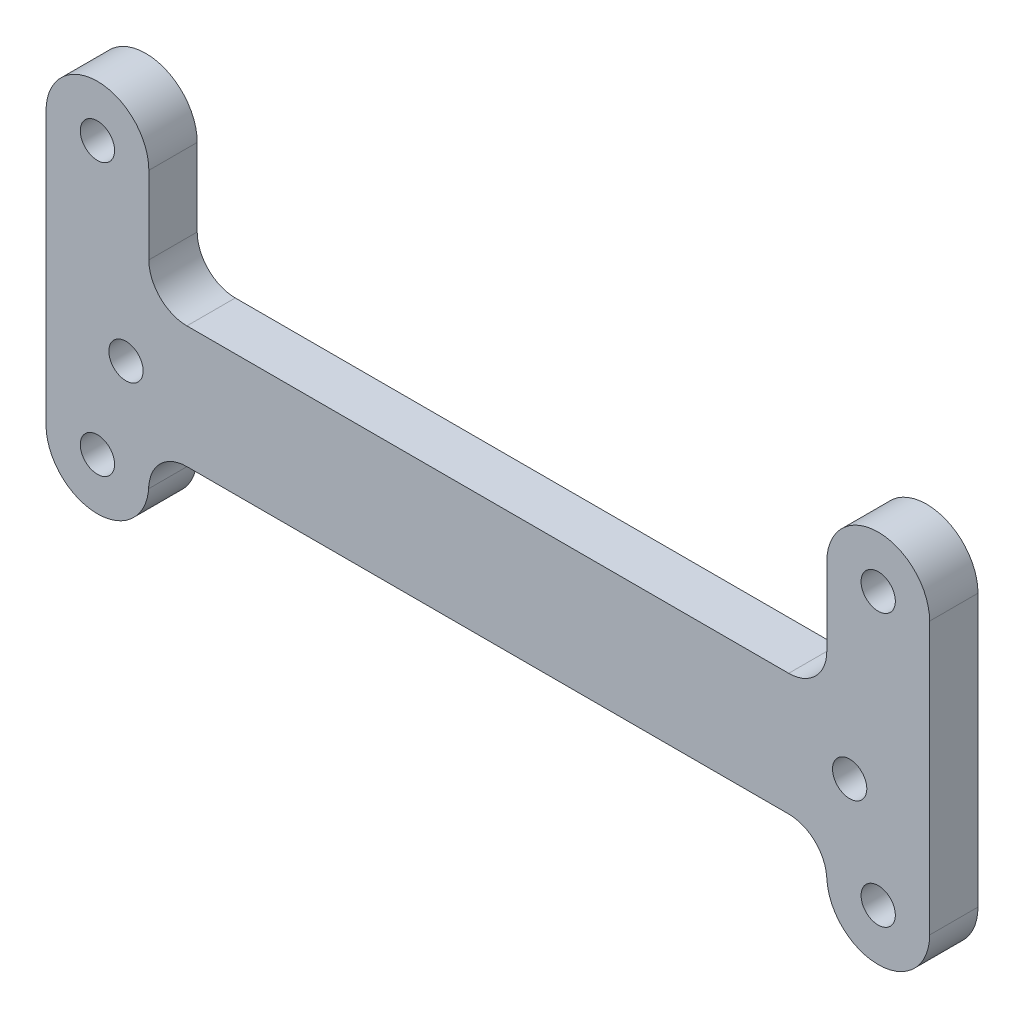
ISO-10303-21;
HEADER;
FILE_DESCRIPTION(('STEP AP214'),'2;1');
FILE_NAME('part.step','',(''),(''),'','','');
FILE_SCHEMA(('AUTOMOTIVE_DESIGN { 1 0 10303 214 1 1 1 1 }'));
ENDSEC;
DATA;
#1=APPLICATION_CONTEXT('core data for automotive mechanical design processes');
#2=APPLICATION_PROTOCOL_DEFINITION('international standard','automotive_design',2000,#1);
#3=PRODUCT_CONTEXT('',#1,'mechanical');
#4=PRODUCT('Part','Part','',(#3));
#5=PRODUCT_RELATED_PRODUCT_CATEGORY('part','',(#4));
#6=PRODUCT_DEFINITION_FORMATION('','',#4);
#7=PRODUCT_DEFINITION_CONTEXT('part definition',#1,'design');
#8=PRODUCT_DEFINITION('design','',#6,#7);
#9=PRODUCT_DEFINITION_SHAPE('','',#8);
#10=(LENGTH_UNIT() NAMED_UNIT(*) SI_UNIT(.MILLI.,.METRE.));
#11=(NAMED_UNIT(*) PLANE_ANGLE_UNIT() SI_UNIT($,.RADIAN.));
#12=(NAMED_UNIT(*) SI_UNIT($,.STERADIAN.) SOLID_ANGLE_UNIT());
#13=UNCERTAINTY_MEASURE_WITH_UNIT(LENGTH_MEASURE(1.E-05),#10,'distance_accuracy_value','');
#14=(GEOMETRIC_REPRESENTATION_CONTEXT(3) GLOBAL_UNCERTAINTY_ASSIGNED_CONTEXT((#13)) GLOBAL_UNIT_ASSIGNED_CONTEXT((#10,
#11,#12)) REPRESENTATION_CONTEXT('',''));
#15=CARTESIAN_POINT('',(0.,0.,0.));
#16=DIRECTION('',(0.,0.,1.));
#17=DIRECTION('',(1.,0.,0.));
#18=AXIS2_PLACEMENT_3D('',#15,#16,#17);
#19=CARTESIAN_POINT('',(39.4999999999967,13.,64.905));
#20=DIRECTION('',(0.,0.,-1.));
#21=DIRECTION('',(-1.,0.,0.));
#22=AXIS2_PLACEMENT_3D('',#19,#20,#21);
#23=PLANE('',#22);
#24=CARTESIAN_POINT('',(-51.2500000000033,23.1840462387506,64.905));
#25=DIRECTION('',(0.,0.,-1.));
#26=DIRECTION('',(-1.,0.,0.));
#27=AXIS2_PLACEMENT_3D('',#24,#25,#26);
#28=CIRCLE('',#27,2.24999999999353);
#29=CARTESIAN_POINT('',(-53.4999999999968,23.1840462387506,64.905));
#30=VERTEX_POINT('',#29);
#31=EDGE_CURVE('E351',#30,#30,#28,.T.);
#32=ORIENTED_EDGE('',*,*,#31,.F.);
#33=EDGE_LOOP('',(#32));
#34=FACE_BOUND('',#33,.T.);
#35=CARTESIAN_POINT('',(47.5,0.,64.905));
#36=DIRECTION('',(0.,0.,-1.));
#37=DIRECTION('',(-1.,0.,0.));
#38=AXIS2_PLACEMENT_3D('',#35,#36,#37);
#39=CIRCLE('',#38,2.25);
#40=CARTESIAN_POINT('',(45.25,0.,64.905));
#41=VERTEX_POINT('',#40);
#42=EDGE_CURVE('E363',#41,#41,#39,.T.);
#43=ORIENTED_EDGE('',*,*,#42,.F.);
#44=EDGE_LOOP('',(#43));
#45=FACE_BOUND('',#44,.T.);
#46=CARTESIAN_POINT('',(-51.2500000000033,-12.496398733788,64.905));
#47=DIRECTION('',(0.,0.,-1.));
#48=DIRECTION('',(-1.,0.,0.));
#49=AXIS2_PLACEMENT_3D('',#46,#47,#48);
#50=CIRCLE('',#49,2.24999999999353);
#51=CARTESIAN_POINT('',(-53.4999999999968,-12.496398733788,64.905));
#52=VERTEX_POINT('',#51);
#53=EDGE_CURVE('E182',#52,#52,#50,.T.);
#54=ORIENTED_EDGE('',*,*,#53,.F.);
#55=EDGE_LOOP('',(#54));
#56=FACE_BOUND('',#55,.T.);
#57=CARTESIAN_POINT('',(39.4999999999967,13.,64.905));
#58=DIRECTION('',(0.,0.,1.));
#59=DIRECTION('',(-1.,0.,0.));
#60=AXIS2_PLACEMENT_3D('',#57,#58,#59);
#61=CIRCLE('',#60,5.);
#62=CARTESIAN_POINT('',(39.4999999999967,7.99999999999999,64.905));
#63=VERTEX_POINT('',#62);
#64=CARTESIAN_POINT('',(44.4999999999967,13.,64.905));
#65=VERTEX_POINT('',#64);
#66=EDGE_CURVE('E209',#63,#65,#61,.T.);
#67=ORIENTED_EDGE('',*,*,#66,.T.);
#68=DIRECTION('',(0.,1.,0.));
#69=VECTOR('',#68,1.);
#70=CARTESIAN_POINT('',(44.4999999999967,23.1840462387505,64.905));
#71=LINE('',#70,#69);
#72=CARTESIAN_POINT('',(44.4999999999967,23.1840462387505,64.905));
#73=VERTEX_POINT('',#72);
#74=EDGE_CURVE('E117',#65,#73,#71,.T.);
#75=ORIENTED_EDGE('',*,*,#74,.T.);
#76=CARTESIAN_POINT('',(51.2499999999967,23.1840462387505,64.905));
#77=DIRECTION('',(0.,0.,-1.));
#78=DIRECTION('',(-1.,0.,0.));
#79=AXIS2_PLACEMENT_3D('',#76,#77,#78);
#80=CIRCLE('',#79,6.75000000000001);
#81=CARTESIAN_POINT('',(57.9999999999967,23.1840462387505,64.905));
#82=VERTEX_POINT('',#81);
#83=EDGE_CURVE('E248',#73,#82,#80,.T.);
#84=ORIENTED_EDGE('',*,*,#83,.T.);
#85=DIRECTION('',(0.,-1.,0.));
#86=VECTOR('',#85,1.);
#87=CARTESIAN_POINT('',(57.9999999999967,-12.496398733788,64.905));
#88=LINE('',#87,#86);
#89=CARTESIAN_POINT('',(57.9999999999967,-12.496398733788,64.905));
#90=VERTEX_POINT('',#89);
#91=EDGE_CURVE('E267',#82,#90,#88,.T.);
#92=ORIENTED_EDGE('',*,*,#91,.T.);
#93=CARTESIAN_POINT('',(51.2499999999967,-12.496398733788,64.905));
#94=DIRECTION('',(0.,0.,-1.));
#95=DIRECTION('',(-1.,0.,0.));
#96=AXIS2_PLACEMENT_3D('',#93,#94,#95);
#97=CIRCLE('',#96,6.75000000000001);
#98=CARTESIAN_POINT('',(44.5247533860782,-13.0739435216423,64.905));
#99=VERTEX_POINT('',#98);
#100=EDGE_CURVE('E264',#90,#99,#97,.T.);
#101=ORIENTED_EDGE('',*,*,#100,.T.);
#102=DIRECTION('',(-0.0855621907932028,0.996332831691633,0.));
#103=VECTOR('',#102,1.);
#104=CARTESIAN_POINT('',(44.5247533860782,-13.0739435216423,64.905));
#105=LINE('',#104,#103);
#106=CARTESIAN_POINT('',(44.4816641584548,-12.5721890460339,64.905));
#107=VERTEX_POINT('',#106);
#108=EDGE_CURVE('E266',#99,#107,#105,.T.);
#109=ORIENTED_EDGE('',*,*,#108,.T.);
#110=CARTESIAN_POINT('',(39.4999999999967,-13.,64.905));
#111=DIRECTION('',(0.,0.,1.));
#112=DIRECTION('',(1.,0.,0.));
#113=AXIS2_PLACEMENT_3D('',#110,#111,#112);
#114=CIRCLE('',#113,5.);
#115=CARTESIAN_POINT('',(39.4999999999967,-8.,64.905));
#116=VERTEX_POINT('',#115);
#117=EDGE_CURVE('E269',#107,#116,#114,.T.);
#118=ORIENTED_EDGE('',*,*,#117,.T.);
#119=DIRECTION('',(-1.,0.,0.));
#120=VECTOR('',#119,1.);
#121=CARTESIAN_POINT('',(39.4999999999967,-8.,64.905));
#122=LINE('',#121,#120);
#123=CARTESIAN_POINT('',(-39.5000000000033,-7.99999999999999,64.905));
#124=VERTEX_POINT('',#123);
#125=EDGE_CURVE('E275',#116,#124,#122,.T.);
#126=ORIENTED_EDGE('',*,*,#125,.T.);
#127=CARTESIAN_POINT('',(-39.5000000000033,-13.,64.905));
#128=DIRECTION('',(0.,0.,1.));
#129=DIRECTION('',(-1.,0.,0.));
#130=AXIS2_PLACEMENT_3D('',#127,#128,#129);
#131=CIRCLE('',#130,5.);
#132=CARTESIAN_POINT('',(-44.5000000000033,-13.,64.905));
#133=VERTEX_POINT('',#132);
#134=EDGE_CURVE('E277',#124,#133,#131,.T.);
#135=ORIENTED_EDGE('',*,*,#134,.T.);
#136=DIRECTION('',(0.,1.,0.));
#137=VECTOR('',#136,1.);
#138=CARTESIAN_POINT('',(-44.5000000000033,-12.496398733788,64.905));
#139=LINE('',#138,#137);
#140=CARTESIAN_POINT('',(-44.5000000000033,-12.496398733788,64.905));
#141=VERTEX_POINT('',#140);
#142=EDGE_CURVE('E279',#133,#141,#139,.T.);
#143=ORIENTED_EDGE('',*,*,#142,.T.);
#144=CARTESIAN_POINT('',(-51.2500000000033,-12.496398733788,64.905));
#145=DIRECTION('',(0.,0.,-1.));
#146=DIRECTION('',(-1.,0.,0.));
#147=AXIS2_PLACEMENT_3D('',#144,#145,#146);
#148=CIRCLE('',#147,6.75);
#149=CARTESIAN_POINT('',(-58.0000000000033,-12.496398733788,64.905));
#150=VERTEX_POINT('',#149);
#151=EDGE_CURVE('E281',#141,#150,#148,.T.);
#152=ORIENTED_EDGE('',*,*,#151,.T.);
#153=DIRECTION('',(0.,1.,0.));
#154=VECTOR('',#153,1.);
#155=CARTESIAN_POINT('',(-58.0000000000033,23.1840462387506,64.905));
#156=LINE('',#155,#154);
#157=CARTESIAN_POINT('',(-58.0000000000033,23.1840462387506,64.905));
#158=VERTEX_POINT('',#157);
#159=EDGE_CURVE('E283',#150,#158,#156,.T.);
#160=ORIENTED_EDGE('',*,*,#159,.T.);
#161=CARTESIAN_POINT('',(-51.2500000000033,23.1840462387506,64.905));
#162=DIRECTION('',(0.,0.,-1.));
#163=DIRECTION('',(-1.,0.,0.));
#164=AXIS2_PLACEMENT_3D('',#161,#162,#163);
#165=CIRCLE('',#164,6.75000000000001);
#166=CARTESIAN_POINT('',(-44.5000000000033,23.1840462387506,64.905));
#167=VERTEX_POINT('',#166);
#168=EDGE_CURVE('E160',#158,#167,#165,.T.);
#169=ORIENTED_EDGE('',*,*,#168,.T.);
#170=DIRECTION('',(0.,-1.,0.));
#171=VECTOR('',#170,1.);
#172=CARTESIAN_POINT('',(-44.5000000000033,23.1840462387506,64.905));
#173=LINE('',#172,#171);
#174=CARTESIAN_POINT('',(-44.5000000000033,13.,64.905));
#175=VERTEX_POINT('',#174);
#176=EDGE_CURVE('E154',#167,#175,#173,.T.);
#177=ORIENTED_EDGE('',*,*,#176,.T.);
#178=CARTESIAN_POINT('',(-39.5000000000033,13.,64.905));
#179=DIRECTION('',(0.,0.,1.));
#180=DIRECTION('',(1.,0.,0.));
#181=AXIS2_PLACEMENT_3D('',#178,#179,#180);
#182=CIRCLE('',#181,5.);
#183=CARTESIAN_POINT('',(-39.5000000000033,8.00000000000001,64.905));
#184=VERTEX_POINT('',#183);
#185=EDGE_CURVE('E158',#175,#184,#182,.T.);
#186=ORIENTED_EDGE('',*,*,#185,.T.);
#187=DIRECTION('',(1.,0.,0.));
#188=VECTOR('',#187,1.);
#189=CARTESIAN_POINT('',(-39.5000000000033,8.00000000000001,64.905));
#190=LINE('',#189,#188);
#191=EDGE_CURVE('E50',#184,#63,#190,.T.);
#192=ORIENTED_EDGE('',*,*,#191,.T.);
#193=EDGE_LOOP('',(#67,#75,#84,#92,#101,#109,#118,#126,#135,#143,#152,#160,#169,#177,#186,#192));
#194=FACE_BOUND('',#193,.T.);
#195=CARTESIAN_POINT('',(-47.5,0.,64.905));
#196=DIRECTION('',(0.,0.,-1.));
#197=DIRECTION('',(-1.,0.,0.));
#198=AXIS2_PLACEMENT_3D('',#195,#196,#197);
#199=CIRCLE('',#198,2.25);
#200=CARTESIAN_POINT('',(-49.75,0.,64.905));
#201=VERTEX_POINT('',#200);
#202=EDGE_CURVE('E369',#201,#201,#199,.T.);
#203=ORIENTED_EDGE('',*,*,#202,.F.);
#204=EDGE_LOOP('',(#203));
#205=FACE_BOUND('',#204,.T.);
#206=CARTESIAN_POINT('',(51.2499999999967,-12.496398733788,64.905));
#207=DIRECTION('',(0.,0.,-1.));
#208=DIRECTION('',(-1.,0.,0.));
#209=AXIS2_PLACEMENT_3D('',#206,#207,#208);
#210=CIRCLE('',#209,2.24999999999353);
#211=CARTESIAN_POINT('',(49.0000000000032,-12.496398733788,64.905));
#212=VERTEX_POINT('',#211);
#213=EDGE_CURVE('E357',#212,#212,#210,.T.);
#214=ORIENTED_EDGE('',*,*,#213,.F.);
#215=EDGE_LOOP('',(#214));
#216=FACE_BOUND('',#215,.T.);
#217=CARTESIAN_POINT('',(51.2499999999967,23.1840462387505,64.905));
#218=DIRECTION('',(0.,0.,-1.));
#219=DIRECTION('',(-1.,0.,0.));
#220=AXIS2_PLACEMENT_3D('',#217,#218,#219);
#221=CIRCLE('',#220,2.24999999999353);
#222=CARTESIAN_POINT('',(49.0000000000031,23.1840462387505,64.905));
#223=VERTEX_POINT('',#222);
#224=EDGE_CURVE('E342',#223,#223,#221,.T.);
#225=ORIENTED_EDGE('',*,*,#224,.F.);
#226=EDGE_LOOP('',(#225));
#227=FACE_BOUND('',#226,.T.);
#228=ADVANCED_FACE('F33',(#34,#45,#56,#194,#205,#216,#227),#23,.T.);
#229=CARTESIAN_POINT('',(39.4999999999967,13.,71.255));
#230=DIRECTION('',(0.,0.,-1.));
#231=DIRECTION('',(-1.,0.,0.));
#232=AXIS2_PLACEMENT_3D('',#229,#230,#231);
#233=PLANE('',#232);
#234=CARTESIAN_POINT('',(39.4999999999967,13.,71.255));
#235=DIRECTION('',(0.,0.,1.));
#236=DIRECTION('',(-1.,0.,0.));
#237=AXIS2_PLACEMENT_3D('',#234,#235,#236);
#238=CIRCLE('',#237,5.);
#239=CARTESIAN_POINT('',(39.4999999999967,7.99999999999999,71.255));
#240=VERTEX_POINT('',#239);
#241=CARTESIAN_POINT('',(44.4999999999967,13.,71.255));
#242=VERTEX_POINT('',#241);
#243=EDGE_CURVE('E178',#240,#242,#238,.T.);
#244=ORIENTED_EDGE('',*,*,#243,.F.);
#245=DIRECTION('',(1.,0.,0.));
#246=VECTOR('',#245,1.);
#247=CARTESIAN_POINT('',(-39.5000000000033,8.00000000000001,71.255));
#248=LINE('',#247,#246);
#249=CARTESIAN_POINT('',(-39.5000000000033,8.00000000000001,71.255));
#250=VERTEX_POINT('',#249);
#251=EDGE_CURVE('E109',#250,#240,#248,.T.);
#252=ORIENTED_EDGE('',*,*,#251,.F.);
#253=CARTESIAN_POINT('',(-39.5000000000033,13.,71.255));
#254=DIRECTION('',(0.,0.,1.));
#255=DIRECTION('',(1.,0.,0.));
#256=AXIS2_PLACEMENT_3D('',#253,#254,#255);
#257=CIRCLE('',#256,5.);
#258=CARTESIAN_POINT('',(-44.5000000000033,13.,71.255));
#259=VERTEX_POINT('',#258);
#260=EDGE_CURVE('E103',#259,#250,#257,.T.);
#261=ORIENTED_EDGE('',*,*,#260,.F.);
#262=DIRECTION('',(0.,-1.,0.));
#263=VECTOR('',#262,1.);
#264=CARTESIAN_POINT('',(-44.5000000000033,23.1840462387506,71.255));
#265=LINE('',#264,#263);
#266=CARTESIAN_POINT('',(-44.5000000000033,23.1840462387506,71.255));
#267=VERTEX_POINT('',#266);
#268=EDGE_CURVE('E168',#267,#259,#265,.T.);
#269=ORIENTED_EDGE('',*,*,#268,.F.);
#270=CARTESIAN_POINT('',(-51.2500000000033,23.1840462387506,71.255));
#271=DIRECTION('',(0.,0.,-1.));
#272=DIRECTION('',(-1.,0.,0.));
#273=AXIS2_PLACEMENT_3D('',#270,#271,#272);
#274=CIRCLE('',#273,6.75000000000001);
#275=CARTESIAN_POINT('',(-58.0000000000033,23.1840462387506,71.255));
#276=VERTEX_POINT('',#275);
#277=EDGE_CURVE('E204',#276,#267,#274,.T.);
#278=ORIENTED_EDGE('',*,*,#277,.F.);
#279=DIRECTION('',(0.,1.,0.));
#280=VECTOR('',#279,1.);
#281=CARTESIAN_POINT('',(-58.0000000000033,23.1840462387506,71.255));
#282=LINE('',#281,#280);
#283=CARTESIAN_POINT('',(-58.0000000000033,-12.496398733788,71.255));
#284=VERTEX_POINT('',#283);
#285=EDGE_CURVE('E202',#284,#276,#282,.T.);
#286=ORIENTED_EDGE('',*,*,#285,.F.);
#287=CARTESIAN_POINT('',(-51.2500000000033,-12.496398733788,71.255));
#288=DIRECTION('',(0.,0.,-1.));
#289=DIRECTION('',(-1.,0.,0.));
#290=AXIS2_PLACEMENT_3D('',#287,#288,#289);
#291=CIRCLE('',#290,6.75);
#292=CARTESIAN_POINT('',(-44.5000000000033,-12.496398733788,71.255));
#293=VERTEX_POINT('',#292);
#294=EDGE_CURVE('E200',#293,#284,#291,.T.);
#295=ORIENTED_EDGE('',*,*,#294,.F.);
#296=DIRECTION('',(0.,1.,0.));
#297=VECTOR('',#296,1.);
#298=CARTESIAN_POINT('',(-44.5000000000033,-12.496398733788,71.255));
#299=LINE('',#298,#297);
#300=CARTESIAN_POINT('',(-44.5000000000033,-13.,71.255));
#301=VERTEX_POINT('',#300);
#302=EDGE_CURVE('E198',#301,#293,#299,.T.);
#303=ORIENTED_EDGE('',*,*,#302,.F.);
#304=CARTESIAN_POINT('',(-39.5000000000033,-13.,71.255));
#305=DIRECTION('',(0.,0.,1.));
#306=DIRECTION('',(-1.,0.,0.));
#307=AXIS2_PLACEMENT_3D('',#304,#305,#306);
#308=CIRCLE('',#307,5.);
#309=CARTESIAN_POINT('',(-39.5000000000033,-7.99999999999999,71.255));
#310=VERTEX_POINT('',#309);
#311=EDGE_CURVE('E196',#310,#301,#308,.T.);
#312=ORIENTED_EDGE('',*,*,#311,.F.);
#313=DIRECTION('',(-1.,0.,0.));
#314=VECTOR('',#313,1.);
#315=CARTESIAN_POINT('',(39.4999999999967,-8.,71.255));
#316=LINE('',#315,#314);
#317=CARTESIAN_POINT('',(39.4999999999967,-8.,71.255));
#318=VERTEX_POINT('',#317);
#319=EDGE_CURVE('E194',#318,#310,#316,.T.);
#320=ORIENTED_EDGE('',*,*,#319,.F.);
#321=CARTESIAN_POINT('',(39.4999999999967,-13.,71.255));
#322=DIRECTION('',(0.,0.,1.));
#323=DIRECTION('',(1.,0.,0.));
#324=AXIS2_PLACEMENT_3D('',#321,#322,#323);
#325=CIRCLE('',#324,5.);
#326=CARTESIAN_POINT('',(44.4816641584548,-12.5721890460339,71.255));
#327=VERTEX_POINT('',#326);
#328=EDGE_CURVE('E192',#327,#318,#325,.T.);
#329=ORIENTED_EDGE('',*,*,#328,.F.);
#330=DIRECTION('',(-0.0855621907932028,0.996332831691633,0.));
#331=VECTOR('',#330,1.);
#332=CARTESIAN_POINT('',(44.5247533860782,-13.0739435216423,71.255));
#333=LINE('',#332,#331);
#334=CARTESIAN_POINT('',(44.5247533860782,-13.0739435216423,71.255));
#335=VERTEX_POINT('',#334);
#336=EDGE_CURVE('E190',#335,#327,#333,.T.);
#337=ORIENTED_EDGE('',*,*,#336,.F.);
#338=CARTESIAN_POINT('',(51.2499999999967,-12.496398733788,71.255));
#339=DIRECTION('',(0.,0.,-1.));
#340=DIRECTION('',(-1.,0.,0.));
#341=AXIS2_PLACEMENT_3D('',#338,#339,#340);
#342=CIRCLE('',#341,6.75000000000001);
#343=CARTESIAN_POINT('',(57.9999999999967,-12.496398733788,71.255));
#344=VERTEX_POINT('',#343);
#345=EDGE_CURVE('E188',#344,#335,#342,.T.);
#346=ORIENTED_EDGE('',*,*,#345,.F.);
#347=DIRECTION('',(0.,-1.,0.));
#348=VECTOR('',#347,1.);
#349=CARTESIAN_POINT('',(57.9999999999967,-12.496398733788,71.255));
#350=LINE('',#349,#348);
#351=CARTESIAN_POINT('',(57.9999999999967,23.1840462387505,71.255));
#352=VERTEX_POINT('',#351);
#353=EDGE_CURVE('E186',#352,#344,#350,.T.);
#354=ORIENTED_EDGE('',*,*,#353,.F.);
#355=CARTESIAN_POINT('',(51.2499999999967,23.1840462387505,71.255));
#356=DIRECTION('',(0.,0.,-1.));
#357=DIRECTION('',(-1.,0.,0.));
#358=AXIS2_PLACEMENT_3D('',#355,#356,#357);
#359=CIRCLE('',#358,6.75000000000001);
#360=CARTESIAN_POINT('',(44.4999999999967,23.1840462387505,71.255));
#361=VERTEX_POINT('',#360);
#362=EDGE_CURVE('E184',#361,#352,#359,.T.);
#363=ORIENTED_EDGE('',*,*,#362,.F.);
#364=DIRECTION('',(0.,1.,0.));
#365=VECTOR('',#364,1.);
#366=CARTESIAN_POINT('',(44.4999999999967,23.1840462387505,71.255));
#367=LINE('',#366,#365);
#368=EDGE_CURVE('E181',#242,#361,#367,.T.);
#369=ORIENTED_EDGE('',*,*,#368,.F.);
#370=EDGE_LOOP('',(#244,#252,#261,#269,#278,#286,#295,#303,#312,#320,#329,#337,#346,#354,#363,#369));
#371=FACE_BOUND('',#370,.T.);
#372=CARTESIAN_POINT('',(-51.2500000000033,-12.496398733788,71.255));
#373=DIRECTION('',(0.,0.,-1.));
#374=DIRECTION('',(-1.,0.,0.));
#375=AXIS2_PLACEMENT_3D('',#372,#373,#374);
#376=CIRCLE('',#375,2.24999999999353);
#377=CARTESIAN_POINT('',(-53.4999999999968,-12.496398733788,71.255));
#378=VERTEX_POINT('',#377);
#379=EDGE_CURVE('E372',#378,#378,#376,.T.);
#380=ORIENTED_EDGE('',*,*,#379,.T.);
#381=EDGE_LOOP('',(#380));
#382=FACE_BOUND('',#381,.T.);
#383=CARTESIAN_POINT('',(-47.5,0.,71.255));
#384=DIRECTION('',(0.,0.,-1.));
#385=DIRECTION('',(-1.,0.,0.));
#386=AXIS2_PLACEMENT_3D('',#383,#384,#385);
#387=CIRCLE('',#386,2.25);
#388=CARTESIAN_POINT('',(-49.75,0.,71.255));
#389=VERTEX_POINT('',#388);
#390=EDGE_CURVE('E366',#389,#389,#387,.T.);
#391=ORIENTED_EDGE('',*,*,#390,.T.);
#392=EDGE_LOOP('',(#391));
#393=FACE_BOUND('',#392,.T.);
#394=CARTESIAN_POINT('',(47.5,0.,71.255));
#395=DIRECTION('',(0.,0.,-1.));
#396=DIRECTION('',(-1.,0.,0.));
#397=AXIS2_PLACEMENT_3D('',#394,#395,#396);
#398=CIRCLE('',#397,2.25);
#399=CARTESIAN_POINT('',(45.25,0.,71.255));
#400=VERTEX_POINT('',#399);
#401=EDGE_CURVE('E360',#400,#400,#398,.T.);
#402=ORIENTED_EDGE('',*,*,#401,.T.);
#403=EDGE_LOOP('',(#402));
#404=FACE_BOUND('',#403,.T.);
#405=CARTESIAN_POINT('',(51.2499999999967,-12.496398733788,71.255));
#406=DIRECTION('',(0.,0.,-1.));
#407=DIRECTION('',(-1.,0.,0.));
#408=AXIS2_PLACEMENT_3D('',#405,#406,#407);
#409=CIRCLE('',#408,2.24999999999353);
#410=CARTESIAN_POINT('',(49.0000000000032,-12.496398733788,71.255));
#411=VERTEX_POINT('',#410);
#412=EDGE_CURVE('E354',#411,#411,#409,.T.);
#413=ORIENTED_EDGE('',*,*,#412,.T.);
#414=EDGE_LOOP('',(#413));
#415=FACE_BOUND('',#414,.T.);
#416=CARTESIAN_POINT('',(-51.2500000000033,23.1840462387506,71.255));
#417=DIRECTION('',(0.,0.,-1.));
#418=DIRECTION('',(-1.,0.,0.));
#419=AXIS2_PLACEMENT_3D('',#416,#417,#418);
#420=CIRCLE('',#419,2.24999999999353);
#421=CARTESIAN_POINT('',(-53.4999999999968,23.1840462387506,71.255));
#422=VERTEX_POINT('',#421);
#423=EDGE_CURVE('E348',#422,#422,#420,.T.);
#424=ORIENTED_EDGE('',*,*,#423,.T.);
#425=EDGE_LOOP('',(#424));
#426=FACE_BOUND('',#425,.T.);
#427=CARTESIAN_POINT('',(51.2499999999967,23.1840462387505,71.255));
#428=DIRECTION('',(0.,0.,-1.));
#429=DIRECTION('',(-1.,0.,0.));
#430=AXIS2_PLACEMENT_3D('',#427,#428,#429);
#431=CIRCLE('',#430,2.24999999999353);
#432=CARTESIAN_POINT('',(49.0000000000031,23.1840462387505,71.255));
#433=VERTEX_POINT('',#432);
#434=EDGE_CURVE('E345',#433,#433,#431,.T.);
#435=ORIENTED_EDGE('',*,*,#434,.T.);
#436=EDGE_LOOP('',(#435));
#437=FACE_BOUND('',#436,.T.);
#438=ADVANCED_FACE('F252',(#371,#382,#393,#404,#415,#426,#437),#233,.F.);
#439=CARTESIAN_POINT('',(39.4999999999967,13.,64.905));
#440=DIRECTION('',(0.,0.,1.));
#441=DIRECTION('',(1.,0.,0.));
#442=AXIS2_PLACEMENT_3D('',#439,#440,#441);
#443=CYLINDRICAL_SURFACE('',#442,5.);
#444=ORIENTED_EDGE('',*,*,#243,.T.);
#445=DIRECTION('',(0.,0.,1.));
#446=VECTOR('',#445,1.);
#447=CARTESIAN_POINT('',(44.4999999999967,13.,64.905));
#448=LINE('',#447,#446);
#449=EDGE_CURVE('E11',#65,#242,#448,.T.);
#450=ORIENTED_EDGE('',*,*,#449,.F.);
#451=ORIENTED_EDGE('',*,*,#66,.F.);
#452=DIRECTION('',(0.,0.,1.));
#453=VECTOR('',#452,1.);
#454=CARTESIAN_POINT('',(39.4999999999967,7.99999999999999,64.905));
#455=LINE('',#454,#453);
#456=EDGE_CURVE('E174',#63,#240,#455,.T.);
#457=ORIENTED_EDGE('',*,*,#456,.T.);
#458=EDGE_LOOP('',(#444,#450,#451,#457));
#459=FACE_BOUND('',#458,.T.);
#460=ADVANCED_FACE('F35',(#459),#443,.F.);
#461=CARTESIAN_POINT('',(44.4999999999967,23.1840462387505,64.905));
#462=DIRECTION('',(1.,0.,0.));
#463=DIRECTION('',(0.,0.,-1.));
#464=AXIS2_PLACEMENT_3D('',#461,#462,#463);
#465=PLANE('',#464);
#466=ORIENTED_EDGE('',*,*,#368,.T.);
#467=DIRECTION('',(0.,0.,1.));
#468=VECTOR('',#467,1.);
#469=CARTESIAN_POINT('',(44.4999999999967,23.1840462387505,64.905));
#470=LINE('',#469,#468);
#471=EDGE_CURVE('E42',#73,#361,#470,.T.);
#472=ORIENTED_EDGE('',*,*,#471,.F.);
#473=ORIENTED_EDGE('',*,*,#74,.F.);
#474=ORIENTED_EDGE('',*,*,#449,.T.);
#475=EDGE_LOOP('',(#466,#472,#473,#474));
#476=FACE_BOUND('',#475,.T.);
#477=ADVANCED_FACE('F540',(#476),#465,.F.);
#478=CARTESIAN_POINT('',(51.2499999999967,23.1840462387505,64.905));
#479=DIRECTION('',(0.,0.,1.));
#480=DIRECTION('',(1.,0.,0.));
#481=AXIS2_PLACEMENT_3D('',#478,#479,#480);
#482=CYLINDRICAL_SURFACE('',#481,6.75000000000001);
#483=ORIENTED_EDGE('',*,*,#362,.T.);
#484=DIRECTION('',(0.,0.,1.));
#485=VECTOR('',#484,1.);
#486=CARTESIAN_POINT('',(57.9999999999967,23.1840462387505,64.905));
#487=LINE('',#486,#485);
#488=EDGE_CURVE('E240',#82,#352,#487,.T.);
#489=ORIENTED_EDGE('',*,*,#488,.F.);
#490=ORIENTED_EDGE('',*,*,#83,.F.);
#491=ORIENTED_EDGE('',*,*,#471,.T.);
#492=EDGE_LOOP('',(#483,#489,#490,#491));
#493=FACE_BOUND('',#492,.T.);
#494=ADVANCED_FACE('F246',(#493),#482,.T.);
#495=CARTESIAN_POINT('',(57.9999999999967,-12.496398733788,64.905));
#496=DIRECTION('',(-1.,0.,0.));
#497=DIRECTION('',(0.,-1.,0.));
#498=AXIS2_PLACEMENT_3D('',#495,#496,#497);
#499=PLANE('',#498);
#500=ORIENTED_EDGE('',*,*,#353,.T.);
#501=DIRECTION('',(0.,0.,1.));
#502=VECTOR('',#501,1.);
#503=CARTESIAN_POINT('',(57.9999999999967,-12.496398733788,64.905));
#504=LINE('',#503,#502);
#505=EDGE_CURVE('E237',#90,#344,#504,.T.);
#506=ORIENTED_EDGE('',*,*,#505,.F.);
#507=ORIENTED_EDGE('',*,*,#91,.F.);
#508=ORIENTED_EDGE('',*,*,#488,.T.);
#509=EDGE_LOOP('',(#500,#506,#507,#508));
#510=FACE_BOUND('',#509,.T.);
#511=ADVANCED_FACE('F258',(#510),#499,.F.);
#512=CARTESIAN_POINT('',(51.2499999999967,-12.496398733788,64.905));
#513=DIRECTION('',(0.,0.,1.));
#514=DIRECTION('',(1.,0.,0.));
#515=AXIS2_PLACEMENT_3D('',#512,#513,#514);
#516=CYLINDRICAL_SURFACE('',#515,6.75000000000001);
#517=ORIENTED_EDGE('',*,*,#345,.T.);
#518=DIRECTION('',(0.,0.,1.));
#519=VECTOR('',#518,1.);
#520=CARTESIAN_POINT('',(44.5247533860782,-13.0739435216423,64.905));
#521=LINE('',#520,#519);
#522=EDGE_CURVE('E234',#99,#335,#521,.T.);
#523=ORIENTED_EDGE('',*,*,#522,.F.);
#524=ORIENTED_EDGE('',*,*,#100,.F.);
#525=ORIENTED_EDGE('',*,*,#505,.T.);
#526=EDGE_LOOP('',(#517,#523,#524,#525));
#527=FACE_BOUND('',#526,.T.);
#528=ADVANCED_FACE('F262',(#527),#516,.T.);
#529=CARTESIAN_POINT('',(44.5247533860782,-13.0739435216423,64.905));
#530=DIRECTION('',(0.996332831691633,0.0855621907932028,0.));
#531=DIRECTION('',(-0.0855621907932028,0.996332831691633,0.));
#532=AXIS2_PLACEMENT_3D('',#529,#530,#531);
#533=PLANE('',#532);
#534=ORIENTED_EDGE('',*,*,#336,.T.);
#535=DIRECTION('',(0.,0.,1.));
#536=VECTOR('',#535,1.);
#537=CARTESIAN_POINT('',(44.4816641584548,-12.5721890460339,64.905));
#538=LINE('',#537,#536);
#539=EDGE_CURVE('E231',#107,#327,#538,.T.);
#540=ORIENTED_EDGE('',*,*,#539,.F.);
#541=ORIENTED_EDGE('',*,*,#108,.F.);
#542=ORIENTED_EDGE('',*,*,#522,.T.);
#543=EDGE_LOOP('',(#534,#540,#541,#542));
#544=FACE_BOUND('',#543,.T.);
#545=ADVANCED_FACE('F505',(#544),#533,.F.);
#546=CARTESIAN_POINT('',(39.4999999999967,-13.,64.905));
#547=DIRECTION('',(0.,0.,1.));
#548=DIRECTION('',(1.,0.,0.));
#549=AXIS2_PLACEMENT_3D('',#546,#547,#548);
#550=CYLINDRICAL_SURFACE('',#549,5.);
#551=ORIENTED_EDGE('',*,*,#328,.T.);
#552=DIRECTION('',(0.,0.,1.));
#553=VECTOR('',#552,1.);
#554=CARTESIAN_POINT('',(39.4999999999967,-8.,64.905));
#555=LINE('',#554,#553);
#556=EDGE_CURVE('E228',#116,#318,#555,.T.);
#557=ORIENTED_EDGE('',*,*,#556,.F.);
#558=ORIENTED_EDGE('',*,*,#117,.F.);
#559=ORIENTED_EDGE('',*,*,#539,.T.);
#560=EDGE_LOOP('',(#551,#557,#558,#559));
#561=FACE_BOUND('',#560,.T.);
#562=ADVANCED_FACE('F495',(#561),#550,.F.);
#563=CARTESIAN_POINT('',(39.4999999999967,-8.,64.905));
#564=DIRECTION('',(0.,1.,0.));
#565=DIRECTION('',(-1.,0.,0.));
#566=AXIS2_PLACEMENT_3D('',#563,#564,#565);
#567=PLANE('',#566);
#568=ORIENTED_EDGE('',*,*,#319,.T.);
#569=DIRECTION('',(0.,0.,1.));
#570=VECTOR('',#569,1.);
#571=CARTESIAN_POINT('',(-39.5000000000033,-7.99999999999999,64.905));
#572=LINE('',#571,#570);
#573=EDGE_CURVE('E225',#124,#310,#572,.T.);
#574=ORIENTED_EDGE('',*,*,#573,.F.);
#575=ORIENTED_EDGE('',*,*,#125,.F.);
#576=ORIENTED_EDGE('',*,*,#556,.T.);
#577=EDGE_LOOP('',(#568,#574,#575,#576));
#578=FACE_BOUND('',#577,.T.);
#579=ADVANCED_FACE('F485',(#578),#567,.F.);
#580=CARTESIAN_POINT('',(-39.5000000000033,-13.,64.905));
#581=DIRECTION('',(0.,0.,1.));
#582=DIRECTION('',(1.,0.,0.));
#583=AXIS2_PLACEMENT_3D('',#580,#581,#582);
#584=CYLINDRICAL_SURFACE('',#583,5.);
#585=ORIENTED_EDGE('',*,*,#311,.T.);
#586=DIRECTION('',(0.,0.,1.));
#587=VECTOR('',#586,1.);
#588=CARTESIAN_POINT('',(-44.5000000000033,-13.,64.905));
#589=LINE('',#588,#587);
#590=EDGE_CURVE('E222',#133,#301,#589,.T.);
#591=ORIENTED_EDGE('',*,*,#590,.F.);
#592=ORIENTED_EDGE('',*,*,#134,.F.);
#593=ORIENTED_EDGE('',*,*,#573,.T.);
#594=EDGE_LOOP('',(#585,#591,#592,#593));
#595=FACE_BOUND('',#594,.T.);
#596=ADVANCED_FACE('F475',(#595),#584,.F.);
#597=CARTESIAN_POINT('',(-44.5000000000033,-12.496398733788,64.905));
#598=DIRECTION('',(1.,0.,0.));
#599=DIRECTION('',(0.,0.,-1.));
#600=AXIS2_PLACEMENT_3D('',#597,#598,#599);
#601=PLANE('',#600);
#602=ORIENTED_EDGE('',*,*,#302,.T.);
#603=DIRECTION('',(0.,0.,1.));
#604=VECTOR('',#603,1.);
#605=CARTESIAN_POINT('',(-44.5000000000033,-12.496398733788,64.905));
#606=LINE('',#605,#604);
#607=EDGE_CURVE('E219',#141,#293,#606,.T.);
#608=ORIENTED_EDGE('',*,*,#607,.F.);
#609=ORIENTED_EDGE('',*,*,#142,.F.);
#610=ORIENTED_EDGE('',*,*,#590,.T.);
#611=EDGE_LOOP('',(#602,#608,#609,#610));
#612=FACE_BOUND('',#611,.T.);
#613=ADVANCED_FACE('F465',(#612),#601,.F.);
#614=CARTESIAN_POINT('',(-51.2500000000033,-12.496398733788,64.905));
#615=DIRECTION('',(0.,0.,1.));
#616=DIRECTION('',(1.,0.,0.));
#617=AXIS2_PLACEMENT_3D('',#614,#615,#616);
#618=CYLINDRICAL_SURFACE('',#617,6.75);
#619=ORIENTED_EDGE('',*,*,#294,.T.);
#620=DIRECTION('',(0.,0.,1.));
#621=VECTOR('',#620,1.);
#622=CARTESIAN_POINT('',(-58.0000000000033,-12.496398733788,64.905));
#623=LINE('',#622,#621);
#624=EDGE_CURVE('E216',#150,#284,#623,.T.);
#625=ORIENTED_EDGE('',*,*,#624,.F.);
#626=ORIENTED_EDGE('',*,*,#151,.F.);
#627=ORIENTED_EDGE('',*,*,#607,.T.);
#628=EDGE_LOOP('',(#619,#625,#626,#627));
#629=FACE_BOUND('',#628,.T.);
#630=ADVANCED_FACE('F456',(#629),#618,.T.);
#631=CARTESIAN_POINT('',(-58.0000000000033,23.1840462387506,64.905));
#632=DIRECTION('',(1.,0.,0.));
#633=DIRECTION('',(0.,1.,0.));
#634=AXIS2_PLACEMENT_3D('',#631,#632,#633);
#635=PLANE('',#634);
#636=ORIENTED_EDGE('',*,*,#285,.T.);
#637=DIRECTION('',(0.,0.,1.));
#638=VECTOR('',#637,1.);
#639=CARTESIAN_POINT('',(-58.0000000000033,23.1840462387506,64.905));
#640=LINE('',#639,#638);
#641=EDGE_CURVE('E213',#158,#276,#640,.T.);
#642=ORIENTED_EDGE('',*,*,#641,.F.);
#643=ORIENTED_EDGE('',*,*,#159,.F.);
#644=ORIENTED_EDGE('',*,*,#624,.T.);
#645=EDGE_LOOP('',(#636,#642,#643,#644));
#646=FACE_BOUND('',#645,.T.);
#647=ADVANCED_FACE('F289',(#646),#635,.F.);
#648=CARTESIAN_POINT('',(-51.2500000000033,23.1840462387506,64.905));
#649=DIRECTION('',(0.,0.,1.));
#650=DIRECTION('',(1.,0.,0.));
#651=AXIS2_PLACEMENT_3D('',#648,#649,#650);
#652=CYLINDRICAL_SURFACE('',#651,6.75000000000001);
#653=ORIENTED_EDGE('',*,*,#277,.T.);
#654=DIRECTION('',(0.,0.,1.));
#655=VECTOR('',#654,1.);
#656=CARTESIAN_POINT('',(-44.5000000000033,23.1840462387506,64.905));
#657=LINE('',#656,#655);
#658=EDGE_CURVE('E169',#167,#267,#657,.T.);
#659=ORIENTED_EDGE('',*,*,#658,.F.);
#660=ORIENTED_EDGE('',*,*,#168,.F.);
#661=ORIENTED_EDGE('',*,*,#641,.T.);
#662=EDGE_LOOP('',(#653,#659,#660,#661));
#663=FACE_BOUND('',#662,.T.);
#664=ADVANCED_FACE('F293',(#663),#652,.T.);
#665=CARTESIAN_POINT('',(-44.5000000000033,23.1840462387506,64.905));
#666=DIRECTION('',(-1.,0.,0.));
#667=DIRECTION('',(0.,-1.,0.));
#668=AXIS2_PLACEMENT_3D('',#665,#666,#667);
#669=PLANE('',#668);
#670=ORIENTED_EDGE('',*,*,#268,.T.);
#671=DIRECTION('',(0.,0.,1.));
#672=VECTOR('',#671,1.);
#673=CARTESIAN_POINT('',(-44.5000000000033,13.,64.905));
#674=LINE('',#673,#672);
#675=EDGE_CURVE('E165',#175,#259,#674,.T.);
#676=ORIENTED_EDGE('',*,*,#675,.F.);
#677=ORIENTED_EDGE('',*,*,#176,.F.);
#678=ORIENTED_EDGE('',*,*,#658,.T.);
#679=EDGE_LOOP('',(#670,#676,#677,#678));
#680=FACE_BOUND('',#679,.T.);
#681=ADVANCED_FACE('F166',(#680),#669,.F.);
#682=CARTESIAN_POINT('',(-39.5000000000033,13.,64.905));
#683=DIRECTION('',(0.,0.,1.));
#684=DIRECTION('',(1.,0.,0.));
#685=AXIS2_PLACEMENT_3D('',#682,#683,#684);
#686=CYLINDRICAL_SURFACE('',#685,5.);
#687=ORIENTED_EDGE('',*,*,#260,.T.);
#688=DIRECTION('',(0.,0.,1.));
#689=VECTOR('',#688,1.);
#690=CARTESIAN_POINT('',(-39.5000000000033,8.00000000000001,64.905));
#691=LINE('',#690,#689);
#692=EDGE_CURVE('E170',#184,#250,#691,.T.);
#693=ORIENTED_EDGE('',*,*,#692,.F.);
#694=ORIENTED_EDGE('',*,*,#185,.F.);
#695=ORIENTED_EDGE('',*,*,#675,.T.);
#696=EDGE_LOOP('',(#687,#693,#694,#695));
#697=FACE_BOUND('',#696,.T.);
#698=ADVANCED_FACE('F172',(#697),#686,.F.);
#699=CARTESIAN_POINT('',(-39.5000000000033,8.00000000000001,64.905));
#700=DIRECTION('',(0.,-1.,0.));
#701=DIRECTION('',(1.,0.,0.));
#702=AXIS2_PLACEMENT_3D('',#699,#700,#701);
#703=PLANE('',#702);
#704=ORIENTED_EDGE('',*,*,#251,.T.);
#705=ORIENTED_EDGE('',*,*,#456,.F.);
#706=ORIENTED_EDGE('',*,*,#191,.F.);
#707=ORIENTED_EDGE('',*,*,#692,.T.);
#708=EDGE_LOOP('',(#704,#705,#706,#707));
#709=FACE_BOUND('',#708,.T.);
#710=ADVANCED_FACE('F297',(#709),#703,.F.);
#711=CARTESIAN_POINT('',(-51.2500000000033,-12.496398733788,64.905));
#712=DIRECTION('',(0.,0.,1.));
#713=DIRECTION('',(1.,0.,0.));
#714=AXIS2_PLACEMENT_3D('',#711,#712,#713);
#715=CYLINDRICAL_SURFACE('',#714,2.24999999999353);
#716=ORIENTED_EDGE('',*,*,#53,.T.);
#717=EDGE_LOOP('',(#716));
#718=FACE_BOUND('',#717,.T.);
#719=ORIENTED_EDGE('',*,*,#379,.F.);
#720=EDGE_LOOP('',(#719));
#721=FACE_BOUND('',#720,.T.);
#722=ADVANCED_FACE('F299',(#718,#721),#715,.F.);
#723=CARTESIAN_POINT('',(-47.5,0.,64.905));
#724=DIRECTION('',(0.,0.,1.));
#725=DIRECTION('',(1.,0.,0.));
#726=AXIS2_PLACEMENT_3D('',#723,#724,#725);
#727=CYLINDRICAL_SURFACE('',#726,2.25);
#728=ORIENTED_EDGE('',*,*,#202,.T.);
#729=EDGE_LOOP('',(#728));
#730=FACE_BOUND('',#729,.T.);
#731=ORIENTED_EDGE('',*,*,#390,.F.);
#732=EDGE_LOOP('',(#731));
#733=FACE_BOUND('',#732,.T.);
#734=ADVANCED_FACE('F305',(#730,#733),#727,.F.);
#735=CARTESIAN_POINT('',(47.5,0.,64.905));
#736=DIRECTION('',(0.,0.,1.));
#737=DIRECTION('',(1.,0.,0.));
#738=AXIS2_PLACEMENT_3D('',#735,#736,#737);
#739=CYLINDRICAL_SURFACE('',#738,2.25);
#740=ORIENTED_EDGE('',*,*,#42,.T.);
#741=EDGE_LOOP('',(#740));
#742=FACE_BOUND('',#741,.T.);
#743=ORIENTED_EDGE('',*,*,#401,.F.);
#744=EDGE_LOOP('',(#743));
#745=FACE_BOUND('',#744,.T.);
#746=ADVANCED_FACE('F321',(#742,#745),#739,.F.);
#747=CARTESIAN_POINT('',(51.2499999999967,-12.496398733788,64.905));
#748=DIRECTION('',(0.,0.,1.));
#749=DIRECTION('',(1.,0.,0.));
#750=AXIS2_PLACEMENT_3D('',#747,#748,#749);
#751=CYLINDRICAL_SURFACE('',#750,2.24999999999353);
#752=ORIENTED_EDGE('',*,*,#213,.T.);
#753=EDGE_LOOP('',(#752));
#754=FACE_BOUND('',#753,.T.);
#755=ORIENTED_EDGE('',*,*,#412,.F.);
#756=EDGE_LOOP('',(#755));
#757=FACE_BOUND('',#756,.T.);
#758=ADVANCED_FACE('F325',(#754,#757),#751,.F.);
#759=CARTESIAN_POINT('',(-51.2500000000033,23.1840462387506,64.905));
#760=DIRECTION('',(0.,0.,1.));
#761=DIRECTION('',(1.,0.,0.));
#762=AXIS2_PLACEMENT_3D('',#759,#760,#761);
#763=CYLINDRICAL_SURFACE('',#762,2.24999999999353);
#764=ORIENTED_EDGE('',*,*,#31,.T.);
#765=EDGE_LOOP('',(#764));
#766=FACE_BOUND('',#765,.T.);
#767=ORIENTED_EDGE('',*,*,#423,.F.);
#768=EDGE_LOOP('',(#767));
#769=FACE_BOUND('',#768,.T.);
#770=ADVANCED_FACE('F329',(#766,#769),#763,.F.);
#771=CARTESIAN_POINT('',(51.2499999999967,23.1840462387505,64.905));
#772=DIRECTION('',(0.,0.,1.));
#773=DIRECTION('',(1.,0.,0.));
#774=AXIS2_PLACEMENT_3D('',#771,#772,#773);
#775=CYLINDRICAL_SURFACE('',#774,2.24999999999353);
#776=ORIENTED_EDGE('',*,*,#224,.T.);
#777=EDGE_LOOP('',(#776));
#778=FACE_BOUND('',#777,.T.);
#779=ORIENTED_EDGE('',*,*,#434,.F.);
#780=EDGE_LOOP('',(#779));
#781=FACE_BOUND('',#780,.T.);
#782=ADVANCED_FACE('F333',(#778,#781),#775,.F.);
#783=CLOSED_SHELL('',(#228,#438,#460,#477,#494,#511,#528,#545,#562,#579,#596,#613,#630,#647,
#664,#681,#698,#710,#722,#734,#746,#758,#770,#782));
#784=MANIFOLD_SOLID_BREP('B2',#783);
#785=ADVANCED_BREP_SHAPE_REPRESENTATION('',(#18,#784),#14);
#786=SHAPE_DEFINITION_REPRESENTATION(#9,#785);
ENDSEC;
END-ISO-10303-21;
